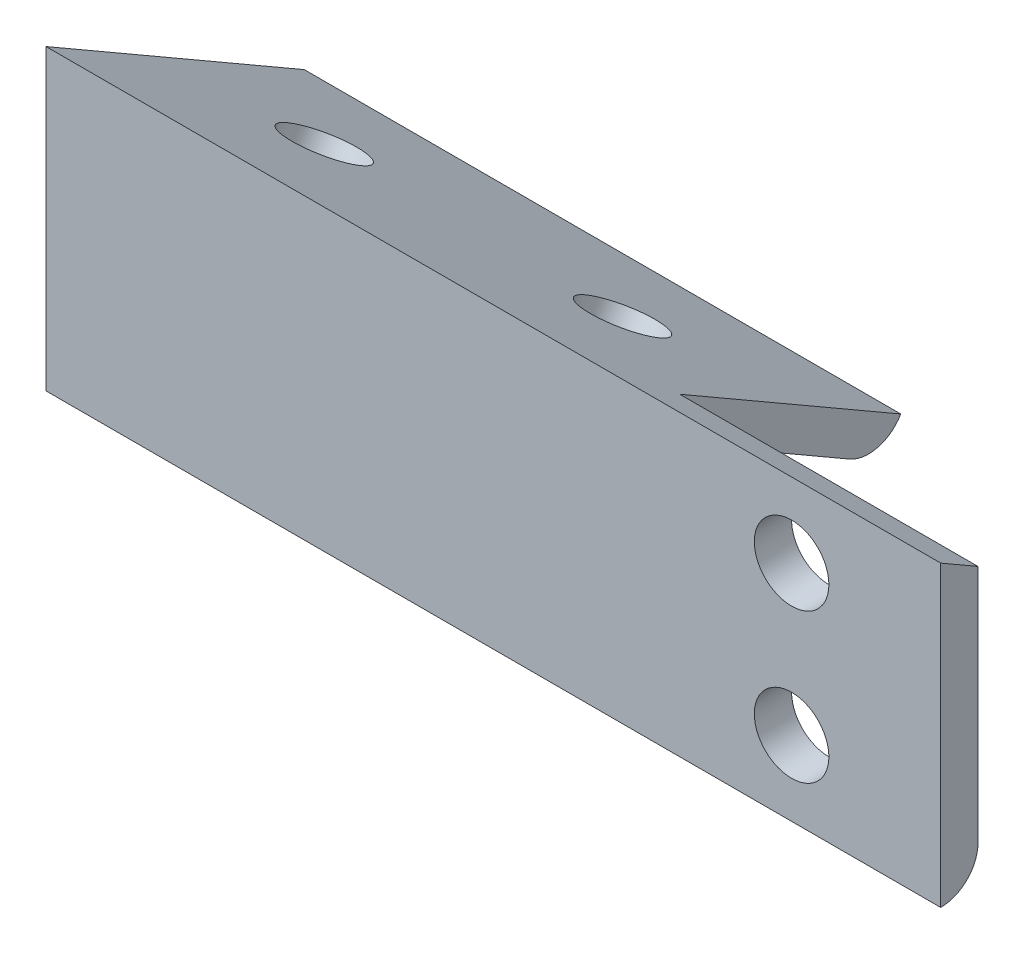
ISO-10303-21;
HEADER;
FILE_DESCRIPTION(('STEP AP214'),'2;1');
FILE_NAME('part.step','',(''),(''),'','','');
FILE_SCHEMA(('AUTOMOTIVE_DESIGN { 1 0 10303 214 1 1 1 1 }'));
ENDSEC;
DATA;
#1=APPLICATION_CONTEXT('core data for automotive mechanical design processes');
#2=APPLICATION_PROTOCOL_DEFINITION('international standard','automotive_design',2000,#1);
#3=PRODUCT_CONTEXT('',#1,'mechanical');
#4=PRODUCT('Part','Part','',(#3));
#5=PRODUCT_RELATED_PRODUCT_CATEGORY('part','',(#4));
#6=PRODUCT_DEFINITION_FORMATION('','',#4);
#7=PRODUCT_DEFINITION_CONTEXT('part definition',#1,'design');
#8=PRODUCT_DEFINITION('design','',#6,#7);
#9=PRODUCT_DEFINITION_SHAPE('','',#8);
#10=(LENGTH_UNIT() NAMED_UNIT(*) SI_UNIT(.MILLI.,.METRE.));
#11=(NAMED_UNIT(*) PLANE_ANGLE_UNIT() SI_UNIT($,.RADIAN.));
#12=(NAMED_UNIT(*) SI_UNIT($,.STERADIAN.) SOLID_ANGLE_UNIT());
#13=UNCERTAINTY_MEASURE_WITH_UNIT(LENGTH_MEASURE(1.E-05),#10,'distance_accuracy_value','');
#14=(GEOMETRIC_REPRESENTATION_CONTEXT(3) GLOBAL_UNCERTAINTY_ASSIGNED_CONTEXT((#13)) GLOBAL_UNIT_ASSIGNED_CONTEXT((#10,
#11,#12)) REPRESENTATION_CONTEXT('',''));
#15=CARTESIAN_POINT('',(0.,0.,0.));
#16=DIRECTION('',(0.,0.,1.));
#17=DIRECTION('',(1.,0.,0.));
#18=AXIS2_PLACEMENT_3D('',#15,#16,#17);
#19=CARTESIAN_POINT('',(76.2,0.,0.));
#20=DIRECTION('',(0.,-0.86602540378444,0.499999999999998));
#21=DIRECTION('',(0.,0.499999999999998,0.86602540378444));
#22=AXIS2_PLACEMENT_3D('',#19,#20,#21);
#23=PLANE('',#22);
#24=CARTESIAN_POINT('',(38.1,-6.34999999999997,-10.9985226280624));
#25=DIRECTION('',(0.,-0.86602540378444,0.499999999999998));
#26=DIRECTION('',(0.,-0.499999999999998,-0.86602540378444));
#27=AXIS2_PLACEMENT_3D('',#24,#25,#26);
#28=CIRCLE('',#27,3.17499999999998);
#29=CARTESIAN_POINT('',(38.1,-7.93749999999996,-13.748153285078));
#30=VERTEX_POINT('',#29);
#31=EDGE_CURVE('E185',#30,#30,#28,.T.);
#32=ORIENTED_EDGE('',*,*,#31,.T.);
#33=EDGE_LOOP('',(#32));
#34=FACE_BOUND('',#33,.T.);
#35=DIRECTION('',(-1.,0.,0.));
#36=VECTOR('',#35,1.);
#37=CARTESIAN_POINT('',(76.2,-12.6999999999999,-21.9970452561248));
#38=LINE('',#37,#36);
#39=CARTESIAN_POINT('',(50.8,-12.6999999999999,-21.9970452561248));
#40=VERTEX_POINT('',#39);
#41=CARTESIAN_POINT('',(0.,-12.6999999999999,-21.9970452561248));
#42=VERTEX_POINT('',#41);
#43=EDGE_CURVE('E11',#40,#42,#38,.T.);
#44=ORIENTED_EDGE('',*,*,#43,.T.);
#45=DIRECTION('',(0.,-0.499999999999998,-0.86602540378444));
#46=VECTOR('',#45,1.);
#47=CARTESIAN_POINT('',(0.,0.,0.));
#48=LINE('',#47,#46);
#49=CARTESIAN_POINT('',(0.,0.,0.));
#50=VERTEX_POINT('',#49);
#51=EDGE_CURVE('E137',#50,#42,#48,.T.);
#52=ORIENTED_EDGE('',*,*,#51,.F.);
#53=DIRECTION('',(-1.,0.,0.));
#54=VECTOR('',#53,1.);
#55=CARTESIAN_POINT('',(76.2,0.,0.));
#56=LINE('',#55,#54);
#57=CARTESIAN_POINT('',(76.2,0.,0.));
#58=VERTEX_POINT('',#57);
#59=EDGE_CURVE('E128',#58,#50,#56,.T.);
#60=ORIENTED_EDGE('',*,*,#59,.F.);
#61=DIRECTION('',(0.,-0.499999999999998,-0.86602540378444));
#62=VECTOR('',#61,1.);
#63=CARTESIAN_POINT('',(76.2,0.,0.));
#64=LINE('',#63,#62);
#65=CARTESIAN_POINT('',(76.2,-1.83308710467706,-3.175));
#66=VERTEX_POINT('',#65);
#67=EDGE_CURVE('E110',#58,#66,#64,.T.);
#68=ORIENTED_EDGE('',*,*,#67,.T.);
#69=DIRECTION('',(-1.,0.,0.));
#70=VECTOR('',#69,1.);
#71=CARTESIAN_POINT('',(50.8,-1.83308710467705,-3.17499999999999));
#72=LINE('',#71,#70);
#73=CARTESIAN_POINT('',(50.8,-1.83308710467706,-3.17499999999999));
#74=VERTEX_POINT('',#73);
#75=EDGE_CURVE('E114',#66,#74,#72,.T.);
#76=ORIENTED_EDGE('',*,*,#75,.T.);
#77=DIRECTION('',(0.,-0.499999999999998,-0.86602540378444));
#78=VECTOR('',#77,1.);
#79=CARTESIAN_POINT('',(50.8,-7.72506532850775,-13.3802056407642));
#80=LINE('',#79,#78);
#81=EDGE_CURVE('E123',#74,#40,#80,.T.);
#82=ORIENTED_EDGE('',*,*,#81,.T.);
#83=EDGE_LOOP('',(#44,#52,#60,#68,#76,#82));
#84=FACE_BOUND('',#83,.T.);
#85=CARTESIAN_POINT('',(12.7,-6.34999999999997,-10.9985226280624));
#86=DIRECTION('',(0.,-0.86602540378444,0.499999999999998));
#87=DIRECTION('',(0.,-0.499999999999998,-0.86602540378444));
#88=AXIS2_PLACEMENT_3D('',#85,#86,#87);
#89=CIRCLE('',#88,3.17499999999999);
#90=CARTESIAN_POINT('',(12.7,-7.93749999999996,-13.748153285078));
#91=VERTEX_POINT('',#90);
#92=EDGE_CURVE('E191',#91,#91,#89,.T.);
#93=ORIENTED_EDGE('',*,*,#92,.T.);
#94=EDGE_LOOP('',(#93));
#95=FACE_BOUND('',#94,.T.);
#96=ADVANCED_FACE('F37',(#34,#84,#95),#23,.F.);
#97=CARTESIAN_POINT('',(76.2,-5.49926131403117,-3.175));
#98=DIRECTION('',(0.,0.,1.));
#99=DIRECTION('',(0.,1.,0.));
#100=AXIS2_PLACEMENT_3D('',#97,#98,#99);
#101=PLANE('',#100);
#102=DIRECTION('',(-1.,0.,0.));
#103=VECTOR('',#102,1.);
#104=CARTESIAN_POINT('',(76.2,-22.225,-3.175));
#105=LINE('',#104,#103);
#106=CARTESIAN_POINT('',(63.5,-22.225,-3.175));
#107=VERTEX_POINT('',#106);
#108=CARTESIAN_POINT('',(0.,-22.225,-3.175));
#109=VERTEX_POINT('',#108);
#110=EDGE_CURVE('E152',#107,#109,#105,.T.);
#111=ORIENTED_EDGE('',*,*,#110,.T.);
#112=DIRECTION('',(0.,-1.,0.));
#113=VECTOR('',#112,1.);
#114=CARTESIAN_POINT('',(0.,-5.49926131403117,-3.175));
#115=LINE('',#114,#113);
#116=CARTESIAN_POINT('',(0.,-5.49926131403117,-3.175));
#117=VERTEX_POINT('',#116);
#118=EDGE_CURVE('E144',#117,#109,#115,.T.);
#119=ORIENTED_EDGE('',*,*,#118,.F.);
#120=DIRECTION('',(-1.,0.,0.));
#121=VECTOR('',#120,1.);
#122=CARTESIAN_POINT('',(76.2,-5.49926131403117,-3.175));
#123=LINE('',#122,#121);
#124=CARTESIAN_POINT('',(50.8,-5.49926131403117,-3.17499999999999));
#125=VERTEX_POINT('',#124);
#126=EDGE_CURVE('E155',#125,#117,#123,.T.);
#127=ORIENTED_EDGE('',*,*,#126,.F.);
#128=DIRECTION('',(0.,1.,0.));
#129=VECTOR('',#128,1.);
#130=CARTESIAN_POINT('',(50.8,-25.401,-3.17499999999999));
#131=LINE('',#130,#129);
#132=EDGE_CURVE('E119',#125,#74,#131,.T.);
#133=ORIENTED_EDGE('',*,*,#132,.T.);
#134=ORIENTED_EDGE('',*,*,#75,.F.);
#135=DIRECTION('',(0.,-1.,0.));
#136=VECTOR('',#135,1.);
#137=CARTESIAN_POINT('',(76.2,-5.49926131403117,-3.175));
#138=LINE('',#137,#136);
#139=CARTESIAN_POINT('',(76.2,-22.225,-3.175));
#140=VERTEX_POINT('',#139);
#141=EDGE_CURVE('E106',#66,#140,#138,.T.);
#142=ORIENTED_EDGE('',*,*,#141,.T.);
#143=EDGE_CURVE('E153',#140,#107,#105,.T.);
#144=ORIENTED_EDGE('',*,*,#143,.T.);
#145=CARTESIAN_POINT('',(63.5,-19.05,-3.175));
#146=DIRECTION('',(0.,0.,1.));
#147=DIRECTION('',(1.,0.,0.));
#148=AXIS2_PLACEMENT_3D('',#145,#146,#147);
#149=CIRCLE('',#148,3.17499999999998);
#150=EDGE_CURVE('E51',#107,#107,#149,.T.);
#151=ORIENTED_EDGE('',*,*,#150,.T.);
#152=EDGE_LOOP('',(#111,#119,#127,#133,#134,#142,#144,#151));
#153=FACE_BOUND('',#152,.T.);
#154=CARTESIAN_POINT('',(63.5,-6.35,-3.175));
#155=DIRECTION('',(0.,0.,1.));
#156=DIRECTION('',(1.,0.,0.));
#157=AXIS2_PLACEMENT_3D('',#154,#155,#156);
#158=CIRCLE('',#157,3.17499999999998);
#159=CARTESIAN_POINT('',(66.675,-6.35,-3.175));
#160=VERTEX_POINT('',#159);
#161=EDGE_CURVE('E179',#160,#160,#158,.T.);
#162=ORIENTED_EDGE('',*,*,#161,.T.);
#163=EDGE_LOOP('',(#162));
#164=FACE_BOUND('',#163,.T.);
#165=ADVANCED_FACE('F115',(#153,#164),#101,.F.);
#166=CARTESIAN_POINT('',(76.2,-11.1125,-19.2474145991092));
#167=DIRECTION('',(-1.,0.,0.));
#168=DIRECTION('',(0.,0.,-1.));
#169=AXIS2_PLACEMENT_3D('',#166,#167,#168);
#170=CYLINDRICAL_SURFACE('',#169,3.175);
#171=DIRECTION('',(-1.,0.,0.));
#172=VECTOR('',#171,1.);
#173=CARTESIAN_POINT('',(76.2,-13.8621306570156,-17.6599145991092));
#174=LINE('',#173,#172);
#175=CARTESIAN_POINT('',(50.8,-13.8621306570156,-17.6599145991092));
#176=VERTEX_POINT('',#175);
#177=CARTESIAN_POINT('',(0.,-13.8621306570156,-17.6599145991092));
#178=VERTEX_POINT('',#177);
#179=EDGE_CURVE('E44',#176,#178,#174,.T.);
#180=ORIENTED_EDGE('',*,*,#179,.T.);
#181=CARTESIAN_POINT('',(0.,-11.1125,-19.2474145991092));
#182=DIRECTION('',(-1.,0.,0.));
#183=DIRECTION('',(0.,0.,1.));
#184=AXIS2_PLACEMENT_3D('',#181,#182,#183);
#185=CIRCLE('',#184,3.175);
#186=EDGE_CURVE('E139',#42,#178,#185,.T.);
#187=ORIENTED_EDGE('',*,*,#186,.F.);
#188=ORIENTED_EDGE('',*,*,#43,.F.);
#189=CARTESIAN_POINT('',(50.8,-11.1125,-19.2474145991092));
#190=DIRECTION('',(1.,0.,0.));
#191=DIRECTION('',(0.,0.,-1.));
#192=AXIS2_PLACEMENT_3D('',#189,#190,#191);
#193=CIRCLE('',#192,3.175);
#194=EDGE_CURVE('E124',#40,#176,#193,.F.);
#195=ORIENTED_EDGE('',*,*,#194,.T.);
#196=EDGE_LOOP('',(#180,#187,#188,#195));
#197=FACE_BOUND('',#196,.T.);
#198=ADVANCED_FACE('F161',(#197),#170,.T.);
#199=CARTESIAN_POINT('',(76.2,-13.8621306570156,-17.6599145991092));
#200=DIRECTION('',(0.,0.866025403784439,-0.499999999999999));
#201=DIRECTION('',(0.,-0.499999999999999,-0.86602540378444));
#202=AXIS2_PLACEMENT_3D('',#199,#200,#201);
#203=PLANE('',#202);
#204=CARTESIAN_POINT('',(12.7,-9.09963065701557,-9.41102262806239));
#205=DIRECTION('',(0.,-0.866025403784439,0.499999999999999));
#206=DIRECTION('',(0.,-0.499999999999999,-0.86602540378444));
#207=AXIS2_PLACEMENT_3D('',#204,#205,#206);
#208=CIRCLE('',#207,3.17499999999999);
#209=CARTESIAN_POINT('',(12.7,-10.6871306570156,-12.160653285078));
#210=VERTEX_POINT('',#209);
#211=EDGE_CURVE('E188',#210,#210,#208,.T.);
#212=ORIENTED_EDGE('',*,*,#211,.F.);
#213=EDGE_LOOP('',(#212));
#214=FACE_BOUND('',#213,.T.);
#215=CARTESIAN_POINT('',(38.1,-9.09963065701557,-9.41102262806239));
#216=DIRECTION('',(0.,-0.866025403784439,0.499999999999999));
#217=DIRECTION('',(0.,-0.499999999999999,-0.86602540378444));
#218=AXIS2_PLACEMENT_3D('',#215,#216,#217);
#219=CIRCLE('',#218,3.17499999999999);
#220=CARTESIAN_POINT('',(38.1,-10.6871306570156,-12.160653285078));
#221=VERTEX_POINT('',#220);
#222=EDGE_CURVE('E182',#221,#221,#219,.T.);
#223=ORIENTED_EDGE('',*,*,#222,.F.);
#224=EDGE_LOOP('',(#223));
#225=FACE_BOUND('',#224,.T.);
#226=ORIENTED_EDGE('',*,*,#126,.T.);
#227=DIRECTION('',(0.,0.499999999999999,0.866025403784439));
#228=VECTOR('',#227,1.);
#229=CARTESIAN_POINT('',(0.,-13.8621306570156,-17.6599145991092));
#230=LINE('',#229,#228);
#231=EDGE_CURVE('E142',#178,#117,#230,.T.);
#232=ORIENTED_EDGE('',*,*,#231,.F.);
#233=ORIENTED_EDGE('',*,*,#179,.F.);
#234=DIRECTION('',(0.,0.499999999999999,0.86602540378444));
#235=VECTOR('',#234,1.);
#236=CARTESIAN_POINT('',(50.8,-10.4746959855233,-11.7927056407643));
#237=LINE('',#236,#235);
#238=EDGE_CURVE('E165',#176,#125,#237,.T.);
#239=ORIENTED_EDGE('',*,*,#238,.T.);
#240=EDGE_LOOP('',(#226,#232,#233,#239));
#241=FACE_BOUND('',#240,.T.);
#242=ADVANCED_FACE('F164',(#214,#225,#241),#203,.F.);
#243=CARTESIAN_POINT('',(76.2,-22.225,0.));
#244=DIRECTION('',(-1.,0.,0.));
#245=DIRECTION('',(0.,0.,-1.));
#246=AXIS2_PLACEMENT_3D('',#243,#244,#245);
#247=CYLINDRICAL_SURFACE('',#246,3.175);
#248=CARTESIAN_POINT('',(0.,-22.225,0.));
#249=DIRECTION('',(-1.,0.,0.));
#250=DIRECTION('',(0.,0.,-1.));
#251=AXIS2_PLACEMENT_3D('',#248,#249,#250);
#252=CIRCLE('',#251,3.175);
#253=CARTESIAN_POINT('',(0.,-25.4,0.));
#254=VERTEX_POINT('',#253);
#255=EDGE_CURVE('E130',#109,#254,#252,.T.);
#256=ORIENTED_EDGE('',*,*,#255,.F.);
#257=ORIENTED_EDGE('',*,*,#110,.F.);
#258=ORIENTED_EDGE('',*,*,#143,.F.);
#259=CARTESIAN_POINT('',(76.2,-22.225,0.));
#260=DIRECTION('',(-1.,0.,0.));
#261=DIRECTION('',(0.,0.,-1.));
#262=AXIS2_PLACEMENT_3D('',#259,#260,#261);
#263=CIRCLE('',#262,3.175);
#264=CARTESIAN_POINT('',(76.2,-25.4,0.));
#265=VERTEX_POINT('',#264);
#266=EDGE_CURVE('E90',#140,#265,#263,.T.);
#267=ORIENTED_EDGE('',*,*,#266,.T.);
#268=DIRECTION('',(-1.,0.,0.));
#269=VECTOR('',#268,1.);
#270=CARTESIAN_POINT('',(76.2,-25.4,0.));
#271=LINE('',#270,#269);
#272=EDGE_CURVE('E149',#265,#254,#271,.T.);
#273=ORIENTED_EDGE('',*,*,#272,.T.);
#274=EDGE_LOOP('',(#256,#257,#258,#267,#273));
#275=FACE_BOUND('',#274,.T.);
#276=ADVANCED_FACE('F219',(#275),#247,.T.);
#277=CARTESIAN_POINT('',(76.2,0.,0.));
#278=DIRECTION('',(0.,0.,-1.));
#279=DIRECTION('',(0.,-1.,0.));
#280=AXIS2_PLACEMENT_3D('',#277,#278,#279);
#281=PLANE('',#280);
#282=CARTESIAN_POINT('',(63.5,-6.35,0.));
#283=DIRECTION('',(0.,0.,1.));
#284=DIRECTION('',(0.,-1.,0.));
#285=AXIS2_PLACEMENT_3D('',#282,#283,#284);
#286=CIRCLE('',#285,3.17499999999999);
#287=CARTESIAN_POINT('',(63.5,-9.52499999999999,0.));
#288=VERTEX_POINT('',#287);
#289=EDGE_CURVE('E176',#288,#288,#286,.T.);
#290=ORIENTED_EDGE('',*,*,#289,.F.);
#291=EDGE_LOOP('',(#290));
#292=FACE_BOUND('',#291,.T.);
#293=CARTESIAN_POINT('',(63.5,-19.05,0.));
#294=DIRECTION('',(0.,0.,1.));
#295=DIRECTION('',(0.,-1.,0.));
#296=AXIS2_PLACEMENT_3D('',#293,#294,#295);
#297=CIRCLE('',#296,3.17499999999999);
#298=CARTESIAN_POINT('',(63.5,-22.225,0.));
#299=VERTEX_POINT('',#298);
#300=EDGE_CURVE('E172',#299,#299,#297,.T.);
#301=ORIENTED_EDGE('',*,*,#300,.F.);
#302=EDGE_LOOP('',(#301));
#303=FACE_BOUND('',#302,.T.);
#304=DIRECTION('',(0.,1.,0.));
#305=VECTOR('',#304,1.);
#306=CARTESIAN_POINT('',(0.,0.,0.));
#307=LINE('',#306,#305);
#308=EDGE_CURVE('E85',#254,#50,#307,.T.);
#309=ORIENTED_EDGE('',*,*,#308,.F.);
#310=ORIENTED_EDGE('',*,*,#272,.F.);
#311=DIRECTION('',(0.,1.,0.));
#312=VECTOR('',#311,1.);
#313=CARTESIAN_POINT('',(76.2,0.,0.));
#314=LINE('',#313,#312);
#315=EDGE_CURVE('E59',#265,#58,#314,.T.);
#316=ORIENTED_EDGE('',*,*,#315,.T.);
#317=ORIENTED_EDGE('',*,*,#59,.T.);
#318=EDGE_LOOP('',(#309,#310,#316,#317));
#319=FACE_BOUND('',#318,.T.);
#320=ADVANCED_FACE('F226',(#292,#303,#319),#281,.F.);
#321=CARTESIAN_POINT('',(76.2,-11.1125,-19.2474145991092));
#322=DIRECTION('',(1.,0.,0.));
#323=DIRECTION('',(0.,0.,1.));
#324=AXIS2_PLACEMENT_3D('',#321,#322,#323);
#325=PLANE('',#324);
#326=ORIENTED_EDGE('',*,*,#67,.F.);
#327=ORIENTED_EDGE('',*,*,#315,.F.);
#328=ORIENTED_EDGE('',*,*,#266,.F.);
#329=ORIENTED_EDGE('',*,*,#141,.F.);
#330=EDGE_LOOP('',(#326,#327,#328,#329));
#331=FACE_BOUND('',#330,.T.);
#332=ADVANCED_FACE('F108',(#331),#325,.T.);
#333=CARTESIAN_POINT('',(0.,-11.1125,-19.2474145991092));
#334=DIRECTION('',(1.,0.,0.));
#335=DIRECTION('',(0.,0.,1.));
#336=AXIS2_PLACEMENT_3D('',#333,#334,#335);
#337=PLANE('',#336);
#338=ORIENTED_EDGE('',*,*,#51,.T.);
#339=ORIENTED_EDGE('',*,*,#186,.T.);
#340=ORIENTED_EDGE('',*,*,#231,.T.);
#341=ORIENTED_EDGE('',*,*,#118,.T.);
#342=ORIENTED_EDGE('',*,*,#255,.T.);
#343=ORIENTED_EDGE('',*,*,#308,.T.);
#344=EDGE_LOOP('',(#338,#339,#340,#341,#342,#343));
#345=FACE_BOUND('',#344,.T.);
#346=ADVANCED_FACE('F167',(#345),#337,.F.);
#347=CARTESIAN_POINT('',(50.8,-25.401,-3.17499999999999));
#348=DIRECTION('',(-1.,0.,0.));
#349=DIRECTION('',(0.,0.,-1.));
#350=AXIS2_PLACEMENT_3D('',#347,#348,#349);
#351=PLANE('',#350);
#352=ORIENTED_EDGE('',*,*,#81,.F.);
#353=ORIENTED_EDGE('',*,*,#132,.F.);
#354=ORIENTED_EDGE('',*,*,#238,.F.);
#355=ORIENTED_EDGE('',*,*,#194,.F.);
#356=EDGE_LOOP('',(#352,#353,#354,#355));
#357=FACE_BOUND('',#356,.T.);
#358=ADVANCED_FACE('F244',(#357),#351,.F.);
#359=CARTESIAN_POINT('',(63.5,-19.05,-3.175));
#360=DIRECTION('',(0.,0.,-1.));
#361=DIRECTION('',(1.,0.,0.));
#362=AXIS2_PLACEMENT_3D('',#359,#360,#361);
#363=CYLINDRICAL_SURFACE('',#362,3.17499999999999);
#364=ORIENTED_EDGE('',*,*,#300,.T.);
#365=EDGE_LOOP('',(#364));
#366=FACE_BOUND('',#365,.T.);
#367=ORIENTED_EDGE('',*,*,#150,.F.);
#368=EDGE_LOOP('',(#367));
#369=FACE_BOUND('',#368,.T.);
#370=ADVANCED_FACE('F248',(#366,#369),#363,.F.);
#371=CARTESIAN_POINT('',(63.5,-6.35,-3.175));
#372=DIRECTION('',(0.,0.,-1.));
#373=DIRECTION('',(1.,0.,0.));
#374=AXIS2_PLACEMENT_3D('',#371,#372,#373);
#375=CYLINDRICAL_SURFACE('',#374,3.17499999999999);
#376=ORIENTED_EDGE('',*,*,#289,.T.);
#377=EDGE_LOOP('',(#376));
#378=FACE_BOUND('',#377,.T.);
#379=ORIENTED_EDGE('',*,*,#161,.F.);
#380=EDGE_LOOP('',(#379));
#381=FACE_BOUND('',#380,.T.);
#382=ADVANCED_FACE('F203',(#378,#381),#375,.F.);
#383=CARTESIAN_POINT('',(38.1,-6.34999999999997,-10.9985226280624));
#384=DIRECTION('',(0.,0.86602540378444,-0.499999999999998));
#385=DIRECTION('',(0.,-0.499999999999998,-0.86602540378444));
#386=AXIS2_PLACEMENT_3D('',#383,#384,#385);
#387=CYLINDRICAL_SURFACE('',#386,3.17499999999999);
#388=CARTESIAN_POINT('',(38.1,-10.6871306570156,-12.160653285078));
#389=CARTESIAN_POINT('',(38.1,-10.658488671005,-12.1771897434113));
#390=CARTESIAN_POINT('',(38.1,-10.6298466849944,-12.1937262017446));
#391=CARTESIAN_POINT('',(38.1,-10.5725627129732,-12.2267991184113));
#392=CARTESIAN_POINT('',(38.1,-10.5439207269627,-12.2433355767446));
#393=CARTESIAN_POINT('',(38.1,-10.4866367549415,-12.2764084934113));
#394=CARTESIAN_POINT('',(38.1,-10.4579947689309,-12.2929449517446));
#395=CARTESIAN_POINT('',(38.1,-10.4007107969098,-12.3260178684113));
#396=CARTESIAN_POINT('',(38.1,-10.3720688108992,-12.3425543267446));
#397=CARTESIAN_POINT('',(38.1,-10.314784838878,-12.3756272434113));
#398=CARTESIAN_POINT('',(38.1,-10.2861428528675,-12.3921637017446));
#399=CARTESIAN_POINT('',(38.1,-10.2288588808463,-12.4252366184113));
#400=CARTESIAN_POINT('',(38.1,-10.2002168948357,-12.4417730767446));
#401=CARTESIAN_POINT('',(38.1,-10.1429329228146,-12.4748459934113));
#402=CARTESIAN_POINT('',(38.1,-10.114290936804,-12.4913824517446));
#403=CARTESIAN_POINT('',(38.1,-10.0570069647828,-12.5244553684113));
#404=CARTESIAN_POINT('',(38.1,-10.0283649787722,-12.5409918267446));
#405=CARTESIAN_POINT('',(38.1,-9.97108100675108,-12.5740647434113));
#406=CARTESIAN_POINT('',(38.1,-9.9424390207405,-12.5906012017446));
#407=CARTESIAN_POINT('',(38.1,-9.88515504871934,-12.6236741184113));
#408=CARTESIAN_POINT('',(38.1,-9.85651306270877,-12.6402105767446));
#409=CARTESIAN_POINT('',(38.1,-9.79922909068761,-12.6732834934113));
#410=CARTESIAN_POINT('',(38.1,-9.77058710467703,-12.6898199517446));
#411=CARTESIAN_POINT('',(38.1,-9.71330313265587,-12.7228928684113));
#412=CARTESIAN_POINT('',(38.1,-9.68466114664529,-12.7394293267446));
#413=CARTESIAN_POINT('',(38.1,-9.62737717462413,-12.7725022434113));
#414=CARTESIAN_POINT('',(38.1,-9.59873518861355,-12.7890387017446));
#415=CARTESIAN_POINT('',(38.1,-9.54145121659239,-12.8221116184113));
#416=CARTESIAN_POINT('',(38.1,-9.51280923058182,-12.8386480767446));
#417=CARTESIAN_POINT('',(38.1,-9.45552525856066,-12.8717209934113));
#418=CARTESIAN_POINT('',(38.1,-9.42688327255008,-12.8882574517446));
#419=CARTESIAN_POINT('',(38.1,-9.36959930052892,-12.9213303684113));
#420=CARTESIAN_POINT('',(38.1,-9.34095731451834,-12.9378668267446));
#421=CARTESIAN_POINT('',(38.1,-9.28367334249718,-12.9709397434113));
#422=CARTESIAN_POINT('',(38.1,-9.2550313564866,-12.9874762017446));
#423=CARTESIAN_POINT('',(38.1,-9.19774738446544,-13.0205491184113));
#424=CARTESIAN_POINT('',(38.1,-9.16910539845487,-13.0370855767446));
#425=CARTESIAN_POINT('',(38.1,-9.11182142643371,-13.0701584934113));
#426=CARTESIAN_POINT('',(38.1,-9.08317944042313,-13.0866949517446));
#427=CARTESIAN_POINT('',(38.1,-9.02589546840197,-13.1197678684113));
#428=CARTESIAN_POINT('',(38.1,-8.99725348239139,-13.1363043267446));
#429=CARTESIAN_POINT('',(38.1,-8.93996951037023,-13.1693772434113));
#430=CARTESIAN_POINT('',(38.1,-8.91132752435965,-13.1859137017446));
#431=CARTESIAN_POINT('',(38.1,-8.8540435523385,-13.2189866184113));
#432=CARTESIAN_POINT('',(38.1,-8.82540156632792,-13.2355230767446));
#433=CARTESIAN_POINT('',(38.1,-8.76811759430676,-13.2685959934113));
#434=CARTESIAN_POINT('',(38.1,-8.73947560829618,-13.2851324517446));
#435=CARTESIAN_POINT('',(38.1,-8.68219163627502,-13.3182053684113));
#436=CARTESIAN_POINT('',(38.1,-8.65354965026444,-13.3347418267446));
#437=CARTESIAN_POINT('',(38.1,-8.59626567824328,-13.3678147434113));
#438=CARTESIAN_POINT('',(38.1,-8.5676236922327,-13.3843512017446));
#439=CARTESIAN_POINT('',(38.1,-8.51033972021154,-13.4174241184113));
#440=CARTESIAN_POINT('',(38.1,-8.48169773420097,-13.4339605767446));
#441=CARTESIAN_POINT('',(38.1,-8.42441376217981,-13.4670334934113));
#442=CARTESIAN_POINT('',(38.1,-8.39577177616923,-13.4835699517446));
#443=CARTESIAN_POINT('',(38.1,-8.33848780414807,-13.5166428684113));
#444=CARTESIAN_POINT('',(38.1,-8.30984581813749,-13.5331793267446));
#445=CARTESIAN_POINT('',(38.1,-8.25256184611633,-13.5662522434113));
#446=CARTESIAN_POINT('',(38.1,-8.22391986010575,-13.5827887017446));
#447=CARTESIAN_POINT('',(38.1,-8.16663588808459,-13.6158616184113));
#448=CARTESIAN_POINT('',(38.1,-8.13799390207402,-13.6323980767446));
#449=CARTESIAN_POINT('',(38.1,-8.08070993005286,-13.6654709934113));
#450=CARTESIAN_POINT('',(38.1,-8.05206794404228,-13.6820074517446));
#451=CARTESIAN_POINT('',(38.1,-7.99478397202112,-13.7150803684113));
#452=CARTESIAN_POINT('',(38.1,-7.96614198601054,-13.7316168267446));
#453=CARTESIAN_POINT('',(38.1,-7.93749999999996,-13.748153285078));
#454=B_SPLINE_CURVE_WITH_KNOTS('',3,(#388,#389,#390,#391,#392,#393,#394,#395,#396,#397,#398,
#399,#400,#401,#402,#403,#404,#405,#406,#407,#408,#409,#410,#411,#412,#413,#414,#415,#416,#417,
#418,#419,#420,#421,#422,#423,#424,#425,#426,#427,#428,#429,#430,#431,#432,#433,#434,#435,#436,
#437,#438,#439,#440,#441,#442,#443,#444,#445,#446,#447,#448,#449,#450,#451,#452,#453),
.UNSPECIFIED.,.F.,.F.,(4,2,2,2,2,2,2,2,2,2,2,2,2,2,2,2,2,2,2,2,2,2,2,2,2,2,2,2,2,2,2,2,4),(0.,
0.09921875,0.198437499999999,0.297656249999999,0.396875,0.496093750000001,0.595312500000001,
0.694531250000001,0.79375,0.892968750000001,0.992187500000001,1.09140625,1.190625,1.28984375,
1.3890625,1.48828125,1.5875,1.68671875,1.7859375,1.88515625,1.984375,2.08359375,2.1828125,
2.28203125,2.38125,2.48046875,2.5796875,2.67890625,2.778125,2.87734375,2.9765625,3.07578125,
3.175),.UNSPECIFIED.);
#455=EDGE_CURVE('BSEAM197',#221,#30,#454,.T.);
#456=ORIENTED_EDGE('',*,*,#222,.T.);
#457=ORIENTED_EDGE('',*,*,#31,.F.);
#458=ORIENTED_EDGE('',*,*,#455,.T.);
#459=ORIENTED_EDGE('',*,*,#455,.F.);
#460=EDGE_LOOP('',(#456,#458,#457,#459));
#461=FACE_BOUND('',#460,.T.);
#462=ADVANCED_FACE('F197',(#461),#387,.F.);
#463=CARTESIAN_POINT('',(12.7,-6.34999999999997,-10.9985226280624));
#464=DIRECTION('',(0.,0.86602540378444,-0.499999999999998));
#465=DIRECTION('',(0.,-0.499999999999998,-0.86602540378444));
#466=AXIS2_PLACEMENT_3D('',#463,#464,#465);
#467=CYLINDRICAL_SURFACE('',#466,3.17499999999999);
#468=CARTESIAN_POINT('',(12.7,-10.6871306570156,-12.160653285078));
#469=CARTESIAN_POINT('',(12.7,-10.658488671005,-12.1771897434113));
#470=CARTESIAN_POINT('',(12.7,-10.6298466849944,-12.1937262017446));
#471=CARTESIAN_POINT('',(12.7,-10.5725627129732,-12.2267991184113));
#472=CARTESIAN_POINT('',(12.7,-10.5439207269627,-12.2433355767446));
#473=CARTESIAN_POINT('',(12.7,-10.4866367549415,-12.2764084934113));
#474=CARTESIAN_POINT('',(12.7,-10.4579947689309,-12.2929449517446));
#475=CARTESIAN_POINT('',(12.7,-10.4007107969098,-12.3260178684113));
#476=CARTESIAN_POINT('',(12.7,-10.3720688108992,-12.3425543267446));
#477=CARTESIAN_POINT('',(12.7,-10.314784838878,-12.3756272434113));
#478=CARTESIAN_POINT('',(12.7,-10.2861428528675,-12.3921637017446));
#479=CARTESIAN_POINT('',(12.7,-10.2288588808463,-12.4252366184113));
#480=CARTESIAN_POINT('',(12.7,-10.2002168948357,-12.4417730767446));
#481=CARTESIAN_POINT('',(12.7,-10.1429329228146,-12.4748459934113));
#482=CARTESIAN_POINT('',(12.7,-10.114290936804,-12.4913824517446));
#483=CARTESIAN_POINT('',(12.7,-10.0570069647828,-12.5244553684113));
#484=CARTESIAN_POINT('',(12.7,-10.0283649787722,-12.5409918267446));
#485=CARTESIAN_POINT('',(12.7,-9.97108100675108,-12.5740647434113));
#486=CARTESIAN_POINT('',(12.7,-9.94243902074051,-12.5906012017446));
#487=CARTESIAN_POINT('',(12.7,-9.88515504871935,-12.6236741184113));
#488=CARTESIAN_POINT('',(12.7,-9.85651306270877,-12.6402105767446));
#489=CARTESIAN_POINT('',(12.7,-9.79922909068761,-12.6732834934113));
#490=CARTESIAN_POINT('',(12.7,-9.77058710467703,-12.6898199517446));
#491=CARTESIAN_POINT('',(12.7,-9.71330313265587,-12.7228928684113));
#492=CARTESIAN_POINT('',(12.7,-9.68466114664529,-12.7394293267446));
#493=CARTESIAN_POINT('',(12.7,-9.62737717462413,-12.7725022434113));
#494=CARTESIAN_POINT('',(12.7,-9.59873518861356,-12.7890387017446));
#495=CARTESIAN_POINT('',(12.7,-9.5414512165924,-12.8221116184113));
#496=CARTESIAN_POINT('',(12.7,-9.51280923058182,-12.8386480767446));
#497=CARTESIAN_POINT('',(12.7,-9.45552525856066,-12.8717209934113));
#498=CARTESIAN_POINT('',(12.7,-9.42688327255008,-12.8882574517446));
#499=CARTESIAN_POINT('',(12.7,-9.36959930052892,-12.9213303684113));
#500=CARTESIAN_POINT('',(12.7,-9.34095731451834,-12.9378668267446));
#501=CARTESIAN_POINT('',(12.7,-9.28367334249718,-12.9709397434113));
#502=CARTESIAN_POINT('',(12.7,-9.25503135648661,-12.9874762017446));
#503=CARTESIAN_POINT('',(12.7,-9.19774738446545,-13.0205491184113));
#504=CARTESIAN_POINT('',(12.7,-9.16910539845487,-13.0370855767446));
#505=CARTESIAN_POINT('',(12.7,-9.11182142643371,-13.0701584934113));
#506=CARTESIAN_POINT('',(12.7,-9.08317944042313,-13.0866949517446));
#507=CARTESIAN_POINT('',(12.7,-9.02589546840197,-13.1197678684113));
#508=CARTESIAN_POINT('',(12.7,-8.99725348239139,-13.1363043267446));
#509=CARTESIAN_POINT('',(12.7,-8.93996951037023,-13.1693772434113));
#510=CARTESIAN_POINT('',(12.7,-8.91132752435965,-13.1859137017446));
#511=CARTESIAN_POINT('',(12.7,-8.8540435523385,-13.2189866184113));
#512=CARTESIAN_POINT('',(12.7,-8.82540156632792,-13.2355230767446));
#513=CARTESIAN_POINT('',(12.7,-8.76811759430676,-13.2685959934113));
#514=CARTESIAN_POINT('',(12.7,-8.73947560829618,-13.2851324517446));
#515=CARTESIAN_POINT('',(12.7,-8.68219163627502,-13.3182053684113));
#516=CARTESIAN_POINT('',(12.7,-8.65354965026444,-13.3347418267446));
#517=CARTESIAN_POINT('',(12.7,-8.59626567824328,-13.3678147434113));
#518=CARTESIAN_POINT('',(12.7,-8.5676236922327,-13.3843512017446));
#519=CARTESIAN_POINT('',(12.7,-8.51033972021155,-13.4174241184113));
#520=CARTESIAN_POINT('',(12.7,-8.48169773420097,-13.4339605767446));
#521=CARTESIAN_POINT('',(12.7,-8.42441376217981,-13.4670334934113));
#522=CARTESIAN_POINT('',(12.7,-8.39577177616923,-13.4835699517446));
#523=CARTESIAN_POINT('',(12.7,-8.33848780414807,-13.5166428684113));
#524=CARTESIAN_POINT('',(12.7,-8.30984581813749,-13.5331793267446));
#525=CARTESIAN_POINT('',(12.7,-8.25256184611633,-13.5662522434113));
#526=CARTESIAN_POINT('',(12.7,-8.22391986010576,-13.5827887017446));
#527=CARTESIAN_POINT('',(12.7,-8.1666358880846,-13.6158616184113));
#528=CARTESIAN_POINT('',(12.7,-8.13799390207402,-13.6323980767446));
#529=CARTESIAN_POINT('',(12.7,-8.08070993005286,-13.6654709934113));
#530=CARTESIAN_POINT('',(12.7,-8.05206794404228,-13.6820074517446));
#531=CARTESIAN_POINT('',(12.7,-7.99478397202112,-13.7150803684113));
#532=CARTESIAN_POINT('',(12.7,-7.96614198601054,-13.7316168267446));
#533=CARTESIAN_POINT('',(12.7,-7.93749999999996,-13.748153285078));
#534=B_SPLINE_CURVE_WITH_KNOTS('',3,(#468,#469,#470,#471,#472,#473,#474,#475,#476,#477,#478,
#479,#480,#481,#482,#483,#484,#485,#486,#487,#488,#489,#490,#491,#492,#493,#494,#495,#496,#497,
#498,#499,#500,#501,#502,#503,#504,#505,#506,#507,#508,#509,#510,#511,#512,#513,#514,#515,#516,
#517,#518,#519,#520,#521,#522,#523,#524,#525,#526,#527,#528,#529,#530,#531,#532,#533),
.UNSPECIFIED.,.F.,.F.,(4,2,2,2,2,2,2,2,2,2,2,2,2,2,2,2,2,2,2,2,2,2,2,2,2,2,2,2,2,2,2,2,4),(0.,
0.0992187500000008,0.198437499999999,0.29765625,0.396875,0.496093749999999,0.595312499999999,
0.69453125,0.793750000000001,0.892968750000001,0.992187500000002,1.09140625,1.190625,1.28984375,
1.3890625,1.48828125,1.5875,1.68671875,1.7859375,1.88515625,1.984375,2.08359375,2.1828125,
2.28203125,2.38125,2.48046875,2.5796875,2.67890625,2.778125,2.87734375,2.9765625,3.07578125,
3.17500000000001),.UNSPECIFIED.);
#535=EDGE_CURVE('BSEAM195',#210,#91,#534,.T.);
#536=ORIENTED_EDGE('',*,*,#211,.T.);
#537=ORIENTED_EDGE('',*,*,#92,.F.);
#538=ORIENTED_EDGE('',*,*,#535,.T.);
#539=ORIENTED_EDGE('',*,*,#535,.F.);
#540=EDGE_LOOP('',(#536,#538,#537,#539));
#541=FACE_BOUND('',#540,.T.);
#542=ADVANCED_FACE('F195',(#541),#467,.F.);
#543=CLOSED_SHELL('',(#96,#165,#198,#242,#276,#320,#332,#346,#358,#370,#382,#462,#542));
#544=MANIFOLD_SOLID_BREP('B2',#543);
#545=ADVANCED_BREP_SHAPE_REPRESENTATION('',(#18,#544),#14);
#546=SHAPE_DEFINITION_REPRESENTATION(#9,#545);
ENDSEC;
END-ISO-10303-21;
